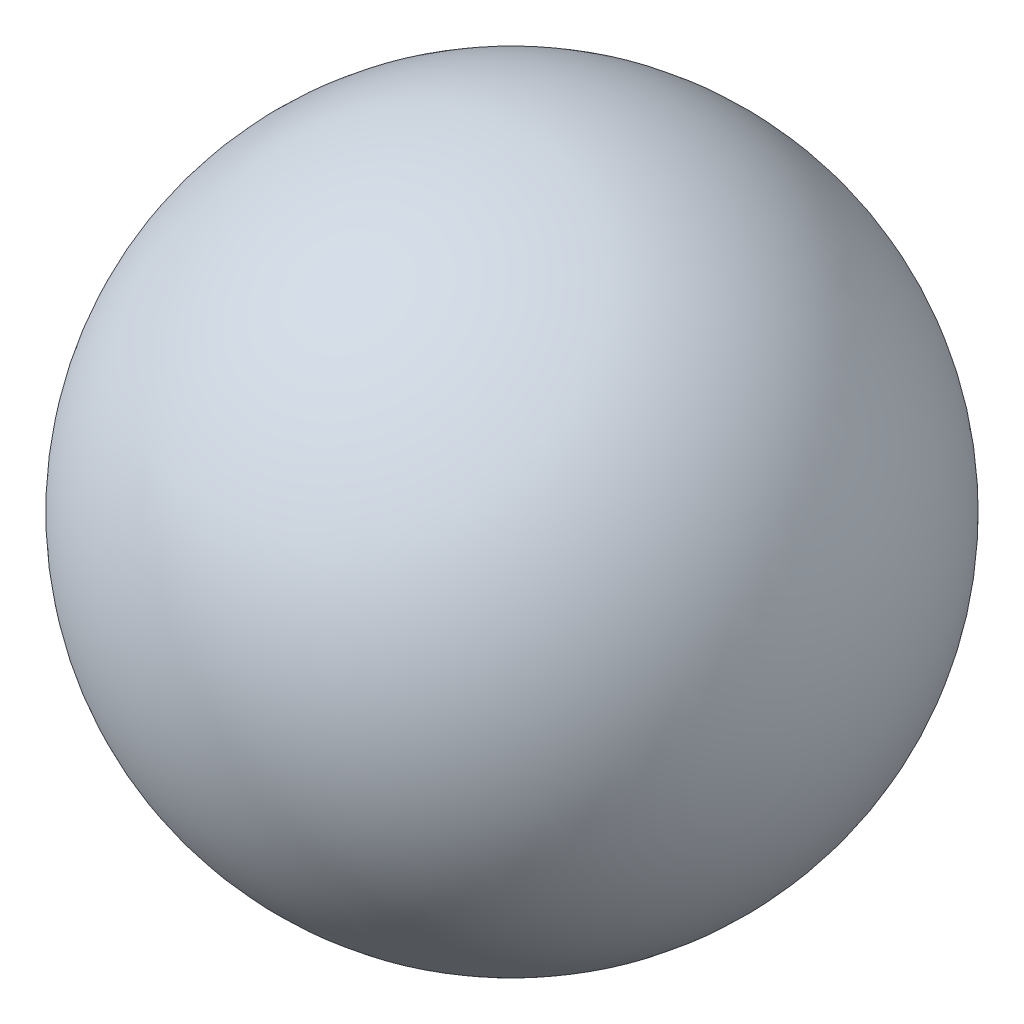
ISO-10303-21;
HEADER;
FILE_DESCRIPTION(('STEP AP214'),'2;1');
FILE_NAME('part.step','',(''),(''),'','','');
FILE_SCHEMA(('AUTOMOTIVE_DESIGN { 1 0 10303 214 1 1 1 1 }'));
ENDSEC;
DATA;
#1=APPLICATION_CONTEXT('core data for automotive mechanical design processes');
#2=APPLICATION_PROTOCOL_DEFINITION('international standard','automotive_design',2000,#1);
#3=PRODUCT_CONTEXT('',#1,'mechanical');
#4=PRODUCT('Part','Part','',(#3));
#5=PRODUCT_RELATED_PRODUCT_CATEGORY('part','',(#4));
#6=PRODUCT_DEFINITION_FORMATION('','',#4);
#7=PRODUCT_DEFINITION_CONTEXT('part definition',#1,'design');
#8=PRODUCT_DEFINITION('design','',#6,#7);
#9=PRODUCT_DEFINITION_SHAPE('','',#8);
#10=(LENGTH_UNIT() NAMED_UNIT(*) SI_UNIT(.MILLI.,.METRE.));
#11=(NAMED_UNIT(*) PLANE_ANGLE_UNIT() SI_UNIT($,.RADIAN.));
#12=(NAMED_UNIT(*) SI_UNIT($,.STERADIAN.) SOLID_ANGLE_UNIT());
#13=UNCERTAINTY_MEASURE_WITH_UNIT(LENGTH_MEASURE(1.E-05),#10,'distance_accuracy_value','');
#14=(GEOMETRIC_REPRESENTATION_CONTEXT(3) GLOBAL_UNCERTAINTY_ASSIGNED_CONTEXT((#13)) GLOBAL_UNIT_ASSIGNED_CONTEXT((#10,
#11,#12)) REPRESENTATION_CONTEXT('',''));
#15=CARTESIAN_POINT('',(0.,0.,0.));
#16=DIRECTION('',(0.,0.,1.));
#17=DIRECTION('',(1.,0.,0.));
#18=AXIS2_PLACEMENT_3D('',#15,#16,#17);
#19=CARTESIAN_POINT('',(0.,41.275,0.));
#20=DIRECTION('',(0.,-1.,0.));
#21=DIRECTION('',(-1.,0.,0.));
#22=AXIS2_PLACEMENT_3D('',#19,#20,#21);
#23=SPHERICAL_SURFACE('',#22,41.275);
#24=CARTESIAN_POINT('',(0.,0.,0.));
#25=VERTEX_POINT('',#24);
#26=VERTEX_LOOP('',#25);
#27=FACE_BOUND('',#26,.T.);
#28=ADVANCED_FACE('F39',(#27),#23,.T.);
#29=CLOSED_SHELL('',(#28));
#30=MANIFOLD_SOLID_BREP('B2',#29);
#31=ADVANCED_BREP_SHAPE_REPRESENTATION('',(#18,#30),#14);
#32=SHAPE_DEFINITION_REPRESENTATION(#9,#31);
ENDSEC;
END-ISO-10303-21;
